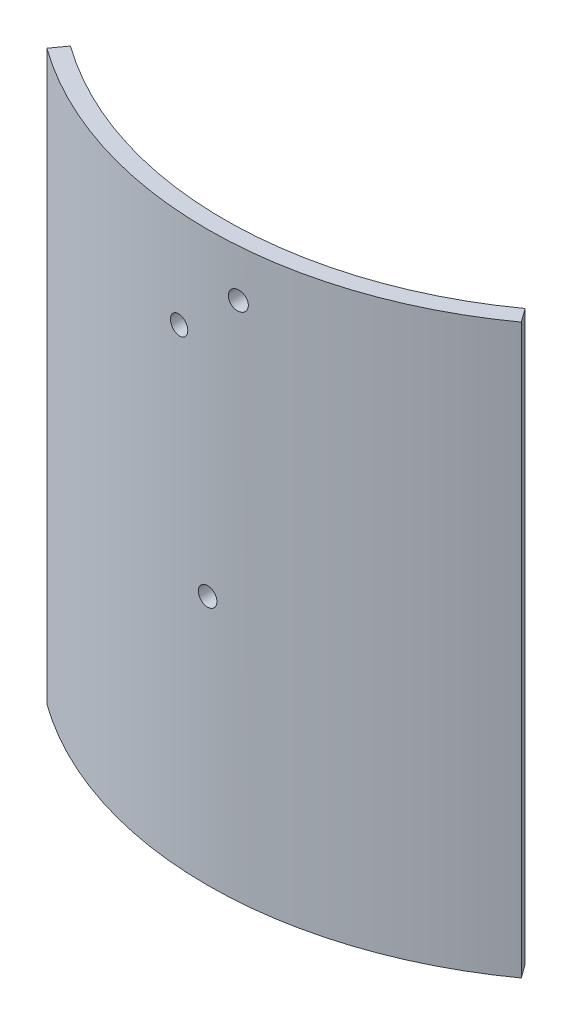
ISO-10303-21;
HEADER;
FILE_DESCRIPTION(('STEP AP214'),'2;1');
FILE_NAME('part.step','',(''),(''),'','','');
FILE_SCHEMA(('AUTOMOTIVE_DESIGN { 1 0 10303 214 1 1 1 1 }'));
ENDSEC;
DATA;
#1=APPLICATION_CONTEXT('core data for automotive mechanical design processes');
#2=APPLICATION_PROTOCOL_DEFINITION('international standard','automotive_design',2000,#1);
#3=PRODUCT_CONTEXT('',#1,'mechanical');
#4=PRODUCT('Part','Part','',(#3));
#5=PRODUCT_RELATED_PRODUCT_CATEGORY('part','',(#4));
#6=PRODUCT_DEFINITION_FORMATION('','',#4);
#7=PRODUCT_DEFINITION_CONTEXT('part definition',#1,'design');
#8=PRODUCT_DEFINITION('design','',#6,#7);
#9=PRODUCT_DEFINITION_SHAPE('','',#8);
#10=(LENGTH_UNIT() NAMED_UNIT(*) SI_UNIT(.MILLI.,.METRE.));
#11=(NAMED_UNIT(*) PLANE_ANGLE_UNIT() SI_UNIT($,.RADIAN.));
#12=(NAMED_UNIT(*) SI_UNIT($,.STERADIAN.) SOLID_ANGLE_UNIT());
#13=UNCERTAINTY_MEASURE_WITH_UNIT(LENGTH_MEASURE(1.E-05),#10,'distance_accuracy_value','');
#14=(GEOMETRIC_REPRESENTATION_CONTEXT(3) GLOBAL_UNCERTAINTY_ASSIGNED_CONTEXT((#13)) GLOBAL_UNIT_ASSIGNED_CONTEXT((#10,
#11,#12)) REPRESENTATION_CONTEXT('',''));
#15=CARTESIAN_POINT('',(0.,0.,0.));
#16=DIRECTION('',(0.,0.,1.));
#17=DIRECTION('',(1.,0.,0.));
#18=AXIS2_PLACEMENT_3D('',#15,#16,#17);
#19=CARTESIAN_POINT('',(0.,114.3,0.));
#20=DIRECTION('',(0.,-1.,0.));
#21=DIRECTION('',(0.,0.,-1.));
#22=AXIS2_PLACEMENT_3D('',#19,#20,#21);
#23=CYLINDRICAL_SURFACE('',#22,76.2);
#24=CARTESIAN_POINT('',(-7.30885000000002,95.885,75.8486698082273));
#25=CARTESIAN_POINT('',(-7.3088455969019,95.9831297900227,75.8486704045491));
#26=CARTESIAN_POINT('',(-7.30058014081593,96.0813305966038,75.8494681097695));
#27=CARTESIAN_POINT('',(-7.26772943756529,96.2750201833792,75.852622700145));
#28=CARTESIAN_POINT('',(-7.24312461224814,96.3705055665923,75.8549814557697));
#29=CARTESIAN_POINT('',(-7.17831763286796,96.5559235349163,75.8611416280274));
#30=CARTESIAN_POINT('',(-7.13812467757525,96.6458593586859,75.8649421937994));
#31=CARTESIAN_POINT('',(-7.04331224321324,96.8176734032789,75.8738031775397));
#32=CARTESIAN_POINT('',(-6.98869615052778,96.8995535093048,75.8788632997628));
#33=CARTESIAN_POINT('',(-6.86644618641582,97.0531833290188,75.8900235999919));
#34=CARTESIAN_POINT('',(-6.79878110415312,97.1249080247993,75.8961262675017));
#35=CARTESIAN_POINT('',(-6.65243968658897,97.2559945208843,75.9090932055006));
#36=CARTESIAN_POINT('',(-6.57376269295756,97.3153555815197,75.9159575215186));
#37=CARTESIAN_POINT('',(-6.40727976822505,97.4202769424109,75.9301900642785));
#38=CARTESIAN_POINT('',(-6.31943807056368,97.4657802331724,75.9375602237468));
#39=CARTESIAN_POINT('',(-6.13737479423293,97.5413867321775,75.9524915020096));
#40=CARTESIAN_POINT('',(-6.04315312601825,97.5714897242214,75.9600526234834));
#41=CARTESIAN_POINT('',(-5.85075291957231,97.6155018893836,75.9751144676348));
#42=CARTESIAN_POINT('',(-5.7525653461878,97.6293716442905,75.9826149995523));
#43=CARTESIAN_POINT('',(-5.55523264248106,97.6403834522302,75.9972971752068));
#44=CARTESIAN_POINT('',(-5.45608751301077,97.6375255201442,76.0044788192275));
#45=CARTESIAN_POINT('',(-5.25967853452254,97.6151500621406,76.0183232797139));
#46=CARTESIAN_POINT('',(-5.16241429658897,97.5956360187352,76.0249862043174));
#47=CARTESIAN_POINT('',(-4.97252186895324,97.5404887545858,76.0376425672563));
#48=CARTESIAN_POINT('',(-4.87989364097644,97.5048556669441,76.0436360111195));
#49=CARTESIAN_POINT('',(-4.70210044909963,97.4185518132351,76.0548366611935));
#50=CARTESIAN_POINT('',(-4.616921387189,97.3679102857894,76.0600453667002));
#51=CARTESIAN_POINT('',(-4.45626758401337,97.2529908994206,76.0696270903777));
#52=CARTESIAN_POINT('',(-4.38079272830127,97.1887132013401,76.0740001184044));
#53=CARTESIAN_POINT('',(-4.24186740412525,97.0484966638141,76.081873025589));
#54=CARTESIAN_POINT('',(-4.17839129274906,96.9725833351597,76.0853747719793));
#55=CARTESIAN_POINT('',(-4.06508207761271,96.8111478381676,76.0915129173219));
#56=CARTESIAN_POINT('',(-4.01524886155693,96.7256257489285,76.0941493233968));
#57=CARTESIAN_POINT('',(-3.93071993194743,96.5475399704268,76.0985626568721));
#58=CARTESIAN_POINT('',(-3.89600155632552,96.4549870690731,76.1003408714185));
#59=CARTESIAN_POINT('',(-3.84258751688773,96.2653560784846,76.1030567226227));
#60=CARTESIAN_POINT('',(-3.82389177848554,96.1682780103169,76.1039943631933));
#61=CARTESIAN_POINT('',(-3.80306624817922,95.9724296876484,76.1050379287701));
#62=CARTESIAN_POINT('',(-3.80092417581769,95.8736607420663,76.1051444703337));
#63=CARTESIAN_POINT('',(-3.81323481755456,95.6771652600538,76.1045286218797));
#64=CARTESIAN_POINT('',(-3.82768749905405,95.5794387215761,76.1038062334906));
#65=CARTESIAN_POINT('',(-3.87277026467221,95.3878192163899,76.1015253098916));
#66=CARTESIAN_POINT('',(-3.90339758378465,95.2939255974099,76.0999669175935));
#67=CARTESIAN_POINT('',(-3.97995206408727,95.1126173833369,76.0960014861131));
#68=CARTESIAN_POINT('',(-4.02587922233239,95.0252027869968,76.0935944470942));
#69=CARTESIAN_POINT('',(-4.13173771889866,94.8593017476186,76.0879198239681));
#70=CARTESIAN_POINT('',(-4.19167354316252,94.7808181765249,76.0846519641609));
#71=CARTESIAN_POINT('',(-4.32382874046206,94.6350301926022,76.0772559525899));
#72=CARTESIAN_POINT('',(-4.39604815457104,94.5677258171552,76.0731277979496));
#73=CARTESIAN_POINT('',(-4.5507842585696,94.4461335928397,76.0640280508263));
#74=CARTESIAN_POINT('',(-4.63331065530573,94.3918581569754,76.0590556616573));
#75=CARTESIAN_POINT('',(-4.80625474344153,94.2979280744795,76.0483228743164));
#76=CARTESIAN_POINT('',(-4.89667249018186,94.258273530392,76.042562470618));
#77=CARTESIAN_POINT('',(-5.0829938726129,94.1946321056603,76.030335375408));
#78=CARTESIAN_POINT('',(-5.17890675279072,94.1706725236483,76.0238674760065));
#79=CARTESIAN_POINT('',(-5.37335475575199,94.139188769204,76.0103713554344));
#80=CARTESIAN_POINT('',(-5.47188991811614,94.1316648449938,76.0033431258031));
#81=CARTESIAN_POINT('',(-5.66901824156279,94.1332502681506,75.9888940622357));
#82=CARTESIAN_POINT('',(-5.76761104344411,94.142396680962,75.9814723891337));
#83=CARTESIAN_POINT('',(-5.96184673760149,94.1771265206207,75.9664786341137));
#84=CARTESIAN_POINT('',(-6.05748958751689,94.202710183388,75.9589065500384));
#85=CARTESIAN_POINT('',(-6.24327396134473,94.2696456872958,75.9438624048451));
#86=CARTESIAN_POINT('',(-6.33340633561111,94.3110229692841,75.936390525347));
#87=CARTESIAN_POINT('',(-6.50543948127761,94.4083775551144,75.921846123491));
#88=CARTESIAN_POINT('',(-6.58734055952279,94.4643543144395,75.9147735862507));
#89=CARTESIAN_POINT('',(-6.74053139539101,94.5892962705101,75.9013251290746));
#90=CARTESIAN_POINT('',(-6.81182775309321,94.6582533276208,75.8949487765158));
#91=CARTESIAN_POINT('',(-6.94183920214558,94.8072588433483,75.8831677136136));
#92=CARTESIAN_POINT('',(-7.00055135944824,94.8873098814149,75.8777632299117));
#93=CARTESIAN_POINT('',(-7.10353238831327,95.0559844050343,75.8681916473328));
#94=CARTESIAN_POINT('',(-7.14783884903606,95.144584785348,75.8640213307097));
#95=CARTESIAN_POINT('',(-7.22088816267678,95.3279512535276,75.8571033820842));
#96=CARTESIAN_POINT('',(-7.24965014140811,95.4227096030379,75.8543540019554));
#97=CARTESIAN_POINT('',(-7.28306780236431,95.5792364923504,75.8511507938312));
#98=CARTESIAN_POINT('',(-7.29272370706151,95.6399733275835,75.8502223038156));
#99=CARTESIAN_POINT('',(-7.30561617555563,95.7621308274326,75.8489816251634));
#100=CARTESIAN_POINT('',(-7.3088527572037,95.8235514901464,75.8486694348129));
#101=CARTESIAN_POINT('',(-7.30885000000002,95.885,75.8486698082273));
#102=B_SPLINE_CURVE_WITH_KNOTS('',3,(#24,#25,#26,#27,#28,#29,#30,#31,#32,#33,#34,#35,#36,#37,
#38,#39,#40,#41,#42,#43,#44,#45,#46,#47,#48,#49,#50,#51,#52,#53,#54,#55,#56,#57,#58,#59,#60,#61,
#62,#63,#64,#65,#66,#67,#68,#69,#70,#71,#72,#73,#74,#75,#76,#77,#78,#79,#80,#81,#82,#83,#84,#85,
#86,#87,#88,#89,#90,#91,#92,#93,#94,#95,#96,#97,#98,#99,#100,#101),.UNSPECIFIED.,.T.,.F.,(4,2,2,
2,2,2,2,2,2,2,2,2,2,2,2,2,2,2,2,2,2,2,2,2,2,2,2,2,2,2,2,2,2,2,2,2,2,2,4),(0.,0.294164506698125,
0.588682124598543,0.883026207394075,1.17730124299184,1.47228906253624,1.76729452500647,
2.06349770806407,2.35970504930802,2.65663017083409,2.95355502821011,3.25041781880539,
3.54727815811332,3.8435639299505,4.1398462072041,4.43548794813699,4.73112725554931,
5.02632176387592,5.32151489804732,5.61648902000534,5.91146256251389,6.20638569648648,
6.5013087736895,6.79632642271369,7.09134505822347,7.38664365981845,7.68194433245729,
7.97775727454512,8.27357468416432,8.57005062771394,8.86653082661201,9.1634906342881,
9.46043936783048,9.75720250851653,10.0540347654155,10.3500861555467,10.6457724521777,
10.8299776853789,11.014182406333),.UNSPECIFIED.);
#103=CARTESIAN_POINT('',(-7.30885000000002,95.885,75.8486698082273));
#104=VERTEX_POINT('',#103);
#105=EDGE_CURVE('E125',#104,#104,#102,.T.);
#106=ORIENTED_EDGE('',*,*,#105,.T.);
#107=EDGE_LOOP('',(#106));
#108=FACE_BOUND('',#107,.T.);
#109=CARTESIAN_POINT('',(3.80364999999998,105.41,76.1050080262626));
#110=CARTESIAN_POINT('',(3.80365436460022,105.508341511283,76.1050079799172));
#111=CARTESIAN_POINT('',(3.8119550789413,105.606754012567,76.1045943547275));
#112=CARTESIAN_POINT('',(3.8449511460436,105.800867243808,76.1029343261118));
#113=CARTESIAN_POINT('',(3.86966613711016,105.89656458212,76.1016869251316));
#114=CARTESIAN_POINT('',(3.93478113670683,106.082406602789,76.0983479065199));
#115=CARTESIAN_POINT('',(3.97517342808287,106.172553991853,76.0962567042299));
#116=CARTESIAN_POINT('',(4.07047761780638,106.3447569792,76.091218139315));
#117=CARTESIAN_POINT('',(4.12538592722295,106.426814570725,76.0882709882965));
#118=CARTESIAN_POINT('',(4.24818742335738,106.580582935634,76.0815133623831));
#119=CARTESIAN_POINT('',(4.3160868562273,106.65228870263,76.0777024720376));
#120=CARTESIAN_POINT('',(4.4629174311383,106.783284809845,76.0692300758492));
#121=CARTESIAN_POINT('',(4.54184904825515,106.842574615125,76.0645685333723));
#122=CARTESIAN_POINT('',(4.70859098285083,106.947132394885,76.0544288312417));
#123=CARTESIAN_POINT('',(4.79641158561531,106.992383874101,76.0489497220401));
#124=CARTESIAN_POINT('',(4.9783548848172,107.067507488873,76.0372558998053));
#125=CARTESIAN_POINT('',(5.07247763167081,107.09737950138,76.031041180887));
#126=CARTESIAN_POINT('',(5.26454594134623,107.14096269742,76.017983622515));
#127=CARTESIAN_POINT('',(5.36249863538503,107.154642090597,76.0111395758057));
#128=CARTESIAN_POINT('',(5.55927802477874,107.165365287631,75.9970009778684));
#129=CARTESIAN_POINT('',(5.65810473074042,107.162408889323,75.9897064211667));
#130=CARTESIAN_POINT('',(5.85405749396384,107.139931874031,75.9748622156312));
#131=CARTESIAN_POINT('',(5.95117935527185,107.120375014594,75.9673120433873));
#132=CARTESIAN_POINT('',(6.14075270753954,107.065206640089,75.9522231684793));
#133=CARTESIAN_POINT('',(6.2332041457752,107.029594943825,75.9446844659455));
#134=CARTESIAN_POINT('',(6.41091588261515,106.943271551864,75.9298895375268));
#135=CARTESIAN_POINT('',(6.49616833000474,106.892543636563,75.922633624578));
#136=CARTESIAN_POINT('',(6.65694348996355,106.777426615949,75.9087058592588));
#137=CARTESIAN_POINT('',(6.73246624300256,106.713037567461,75.9020340044592));
#138=CARTESIAN_POINT('',(6.8715221217819,106.572507562271,75.8895714964618));
#139=CARTESIAN_POINT('',(6.93507157203987,106.496382867515,75.8837796455759));
#140=CARTESIAN_POINT('',(7.04847502083984,106.334467326194,75.8733303186513));
#141=CARTESIAN_POINT('',(7.09832929399006,106.248676673495,75.8686728198674));
#142=CARTESIAN_POINT('',(7.18273400130964,106.070200845101,75.8607285205186));
#143=CARTESIAN_POINT('',(7.21734022419332,105.9775422765,75.8574367258193));
#144=CARTESIAN_POINT('',(7.27050575320777,105.787691331065,75.8523596584288));
#145=CARTESIAN_POINT('',(7.28906545376543,105.690499065732,75.8505743487081));
#146=CARTESIAN_POINT('',(7.30955390094289,105.494739247363,75.8486026857167));
#147=CARTESIAN_POINT('',(7.31154616379525,105.396178399204,75.8484102257929));
#148=CARTESIAN_POINT('',(7.29900849968582,105.200124011844,75.8496177522981));
#149=CARTESIAN_POINT('',(7.28447875564458,105.102630460838,75.8510177210968));
#150=CARTESIAN_POINT('',(7.23935030593194,104.911602148347,75.8553380765591));
#151=CARTESIAN_POINT('',(7.20877175380069,104.818062580413,75.8582565562895));
#152=CARTESIAN_POINT('',(7.1324437081674,104.637450884053,75.8654711170246));
#153=CARTESIAN_POINT('',(7.0866940694673,104.550378817537,75.8697672112141));
#154=CARTESIAN_POINT('',(6.98121776358184,104.384954637362,75.8795453296464));
#155=CARTESIAN_POINT('',(6.92145973585607,104.306622679581,75.8850300126675));
#156=CARTESIAN_POINT('',(6.78972864956794,104.161092109079,75.8969297620912));
#157=CARTESIAN_POINT('',(6.71775531395234,104.093893748944,75.9033448495958));
#158=CARTESIAN_POINT('',(6.5633123580516,103.972246877219,75.9168555240617));
#159=CARTESIAN_POINT('',(6.4808010184062,103.91785162793,75.9239537865437));
#160=CARTESIAN_POINT('',(6.3078480913184,103.823682649996,75.9385183846647));
#161=CARTESIAN_POINT('',(6.21740636038195,103.783909185988,75.9459847269626));
#162=CARTESIAN_POINT('',(6.0308460219036,103.719994666469,75.9610273350804));
#163=CARTESIAN_POINT('',(5.93471046890599,103.695903125501,75.9686038725904));
#164=CARTESIAN_POINT('',(5.73974269194737,103.664236229182,75.9835831580521));
#165=CARTESIAN_POINT('',(5.64091044816314,103.656660995275,75.9909859047257));
#166=CARTESIAN_POINT('',(5.44329320577658,103.658253219773,76.0053970435576));
#167=CARTESIAN_POINT('',(5.34450826809288,103.667430419323,76.0124052038306));
#168=CARTESIAN_POINT('',(5.14985704276549,103.702303424844,76.0258409604903));
#169=CARTESIAN_POINT('',(5.05399074036261,103.727999147269,76.0322685598132));
#170=CARTESIAN_POINT('',(4.86806254836808,103.795144214849,76.0443991395164));
#171=CARTESIAN_POINT('',(4.77799192683873,103.836569179571,76.0501032231887));
#172=CARTESIAN_POINT('',(4.60607683097795,103.934012436358,76.0607091918171));
#173=CARTESIAN_POINT('',(4.52423194098907,103.990029990525,76.0656111173152));
#174=CARTESIAN_POINT('',(4.37129497494305,104.114927204204,76.0745532077728));
#175=CARTESIAN_POINT('',(4.30017826367435,104.183776558651,76.0785953560834));
#176=CARTESIAN_POINT('',(4.1704925036053,104.332494866878,76.0858148611535));
#177=CARTESIAN_POINT('',(4.11192644779846,104.412366441711,76.088992011683));
#178=CARTESIAN_POINT('',(4.00911430282368,104.580723981036,76.0944785004198));
#179=CARTESIAN_POINT('',(3.96485005906502,104.669198837418,76.0967889394279));
#180=CARTESIAN_POINT('',(3.89184834523541,104.852270050492,76.1005575887988));
#181=CARTESIAN_POINT('',(3.86309222672467,104.946858901097,76.1020168229043));
#182=CARTESIAN_POINT('',(3.82957856334626,105.103374921581,76.1037087289822));
#183=CARTESIAN_POINT('',(3.81986761205691,105.164283314642,76.1041960358821));
#184=CARTESIAN_POINT('',(3.80690196447756,105.286785180974,76.1048456989652));
#185=CARTESIAN_POINT('',(3.80364726511683,105.348378653921,76.105008055303));
#186=CARTESIAN_POINT('',(3.80364999999998,105.41,76.1050080262626));
#187=B_SPLINE_CURVE_WITH_KNOTS('',3,(#109,#110,#111,#112,#113,#114,#115,#116,#117,#118,#119,
#120,#121,#122,#123,#124,#125,#126,#127,#128,#129,#130,#131,#132,#133,#134,#135,#136,#137,#138,
#139,#140,#141,#142,#143,#144,#145,#146,#147,#148,#149,#150,#151,#152,#153,#154,#155,#156,#157,
#158,#159,#160,#161,#162,#163,#164,#165,#166,#167,#168,#169,#170,#171,#172,#173,#174,#175,#176,
#177,#178,#179,#180,#181,#182,#183,#184,#185,#186),.UNSPECIFIED.,.T.,.F.,(4,2,2,2,2,2,2,2,2,2,2,
2,2,2,2,2,2,2,2,2,2,2,2,2,2,2,2,2,2,2,2,2,2,2,2,2,2,2,4),(0.,0.294799559015695,
0.589952457885218,0.884960251574542,1.17989517582948,1.47497226322716,1.77006206136156,
2.06549729294895,2.36093488825552,2.65695154806072,2.95297180518727,3.24964000676851,
3.54631155666362,3.84330258650024,4.14029238099004,4.43687427919522,4.7334502300678,
5.02893188777559,5.32440628227551,5.6187473624858,5.91308518398143,6.20705426745258,
6.50102616449748,6.7956625688285,7.09030565664884,7.38615364237876,7.68200698234483,
7.97878998414109,8.27557516815931,8.57253298072394,8.86948929135858,9.16598718428464,
9.46247008722706,9.75826145652617,10.054123285803,10.3496080616221,10.6447367217519,
10.8294598773468,11.0141829450837),.UNSPECIFIED.);
#188=CARTESIAN_POINT('',(3.80364999999998,105.41,76.1050080262626));
#189=VERTEX_POINT('',#188);
#190=EDGE_CURVE('E151',#189,#189,#187,.T.);
#191=ORIENTED_EDGE('',*,*,#190,.T.);
#192=EDGE_LOOP('',(#191));
#193=FACE_BOUND('',#192,.T.);
#194=CARTESIAN_POINT('',(-1.75260000000003,54.61,76.1798424338092));
#195=CARTESIAN_POINT('',(-1.75259563930515,54.7084303414838,76.1798427060606));
#196=CARTESIAN_POINT('',(-1.74428003412436,54.8069317228901,76.1800352523601));
#197=CARTESIAN_POINT('',(-1.71122336623507,55.0012207480361,76.1807848304841));
#198=CARTESIAN_POINT('',(-1.68646262125115,55.0970049963796,76.1813422990522));
#199=CARTESIAN_POINT('',(-1.62122178813276,55.2830169406673,76.182758537902));
#200=CARTESIAN_POINT('',(-1.58074931508791,55.3732473039361,76.1836171622015));
#201=CARTESIAN_POINT('',(-1.48524462344363,55.5456076659428,76.1855387755263));
#202=CARTESIAN_POINT('',(-1.43021598632572,55.6277396504375,76.1866017142633));
#203=CARTESIAN_POINT('',(-1.30713914143808,55.7816241715264,76.1888125982125));
#204=CARTESIAN_POINT('',(-1.23908742377864,55.853373900792,76.1899605662899));
#205=CARTESIAN_POINT('',(-1.09190159159452,55.9844338175553,76.1922119153324));
#206=CARTESIAN_POINT('',(-1.01276703847156,56.0437435125121,76.1933152945306));
#207=CARTESIAN_POINT('',(-0.845654699155653,56.1482416296419,76.1953531445735));
#208=CARTESIAN_POINT('',(-0.757676098576607,56.1934287497891,76.196287599841));
#209=CARTESIAN_POINT('',(-0.575378940535037,56.2683903850022,76.1978821189006));
#210=CARTESIAN_POINT('',(-0.481060403265161,56.2981649491544,76.1985421835666));
#211=CARTESIAN_POINT('',(-0.288778399985069,56.3414512950049,76.1995134084227));
#212=CARTESIAN_POINT('',(-0.19081558366155,56.3549659612614,76.199824630498));
#213=CARTESIAN_POINT('',(0.00598877908284789,56.3653577512414,76.2000632928609));
#214=CARTESIAN_POINT('',(0.104830322789346,56.3622349263402,76.1999907343338));
#215=CARTESIAN_POINT('',(0.30056682363872,56.3394428580053,76.19947006902));
#216=CARTESIAN_POINT('',(0.397462145001877,56.3197767406227,76.1990220331843));
#217=CARTESIAN_POINT('',(0.586575636972465,56.2644611647055,76.1978009968408));
#218=CARTESIAN_POINT('',(0.678793799496568,56.2288116785484,76.1970279957714));
#219=CARTESIAN_POINT('',(0.855945218161159,56.1425377447574,76.1952440397538));
#220=CARTESIAN_POINT('',(0.94087777586792,56.0919118634778,76.1942330620269));
#221=CARTESIAN_POINT('',(1.10103935868831,55.9771233162989,76.1920871062238));
#222=CARTESIAN_POINT('',(1.17626837238357,55.9129606344708,76.1909521280017));
#223=CARTESIAN_POINT('',(1.31490562535691,55.7729021260035,76.1886857903196));
#224=CARTESIAN_POINT('',(1.37831112165166,55.6970035841689,76.1875544317588));
#225=CARTESIAN_POINT('',(1.49148035800491,55.5356374427632,76.1854231491533));
#226=CARTESIAN_POINT('',(1.54124409603539,55.4501698417695,76.1844232251279));
#227=CARTESIAN_POINT('',(1.62571687133451,55.272090212667,76.1826675728237));
#228=CARTESIAN_POINT('',(1.66042582325269,55.1794781440574,76.1819118459293));
#229=CARTESIAN_POINT('',(1.71380200520409,54.9897392186514,76.1807298566071));
#230=CARTESIAN_POINT('',(1.73246926122296,54.8926123691687,76.1803035936456));
#231=CARTESIAN_POINT('',(1.75322879257177,54.6966248422234,76.1798286886435));
#232=CARTESIAN_POINT('',(1.75532486547436,54.5977645672101,76.1797799600845));
#233=CARTESIAN_POINT('',(1.74289242300204,54.4010955616575,76.1800653923492));
#234=CARTESIAN_POINT('',(1.72836391863552,54.3032868304218,76.1803995529194));
#235=CARTESIAN_POINT('',(1.68309788097003,54.1115079597491,76.1814130130611));
#236=CARTESIAN_POINT('',(1.6523620702951,54.0175374135068,76.1820922759523));
#237=CARTESIAN_POINT('',(1.57555565740287,53.8360899494674,76.183719332675));
#238=CARTESIAN_POINT('',(1.52948503785143,53.7486130390106,76.1846671268099));
#239=CARTESIAN_POINT('',(1.42330700453581,53.5826185276612,76.1867246078283));
#240=CARTESIAN_POINT('',(1.36319703227441,53.5041025636766,76.1878343242063));
#241=CARTESIAN_POINT('',(1.23065036356723,53.3582751750005,76.1900904408169));
#242=CARTESIAN_POINT('',(1.15821364658422,53.2909637689771,76.1912368411107));
#243=CARTESIAN_POINT('',(1.00305346823081,53.1694435982693,76.1934373372802));
#244=CARTESIAN_POINT('',(0.920328088054838,53.1152372832119,76.1944914158755));
#245=CARTESIAN_POINT('',(0.746948729054476,53.0214827984009,76.1963881931696));
#246=CARTESIAN_POINT('',(0.656294764188809,52.9819346028413,76.1972308922404));
#247=CARTESIAN_POINT('',(0.469640837411378,52.9186232661448,76.1986098286356));
#248=CARTESIAN_POINT('',(0.373641416024191,52.8948585321379,76.1991460968842));
#249=CARTESIAN_POINT('',(0.179013926098036,52.8637834810564,76.1998518396941));
#250=CARTESIAN_POINT('',(0.0803858569584952,52.856473167741,76.2000213141714));
#251=CARTESIAN_POINT('',(-0.116674565023091,52.8585146824683,76.199974365389));
#252=CARTESIAN_POINT('',(-0.215106958024782,52.8678626383956,76.1997580318081));
#253=CARTESIAN_POINT('',(-0.409004932836326,52.9029474005142,76.1989640243434));
#254=CARTESIAN_POINT('',(-0.504470508728896,52.9286842393906,76.198386349739));
#255=CARTESIAN_POINT('',(-0.689727038085921,52.9958159109376,76.1969347471354));
#256=CARTESIAN_POINT('',(-0.77951789059649,53.0372110220788,76.1960608138675));
#257=CARTESIAN_POINT('',(-0.950872901860898,53.1344821125609,76.1941152071278));
#258=CARTESIAN_POINT('',(-1.03243736847085,53.1903575497248,76.19304354106));
#259=CARTESIAN_POINT('',(-1.18504034740304,53.315011790335,76.1908230347117));
#260=CARTESIAN_POINT('',(-1.25607753179294,53.3837922191672,76.1896741847216));
#261=CARTESIAN_POINT('',(-1.38561537877095,53.5323228865533,76.1874286180734));
#262=CARTESIAN_POINT('',(-1.44411292796183,53.6120758413643,76.1863319144148));
#263=CARTESIAN_POINT('',(-1.54691695395182,53.7803117014157,76.1843140127345));
#264=CARTESIAN_POINT('',(-1.59121521392799,53.8687996227973,76.1833929164574));
#265=CARTESIAN_POINT('',(-1.66427548902462,54.0518900362666,76.181832054111));
#266=CARTESIAN_POINT('',(-1.69305607136852,54.1464850685643,76.1811919519975));
#267=CARTESIAN_POINT('',(-1.72661893302397,54.3030665399075,76.1804367387127));
#268=CARTESIAN_POINT('',(-1.73634961516463,54.3640361807526,76.1802148392475));
#269=CARTESIAN_POINT('',(-1.74934151445548,54.4866612483275,76.1799176015024));
#270=CARTESIAN_POINT('',(-1.75260273271593,54.5483166749396,76.1798422631975));
#271=CARTESIAN_POINT('',(-1.75260000000003,54.61,76.1798424338092));
#272=B_SPLINE_CURVE_WITH_KNOTS('',3,(#194,#195,#196,#197,#198,#199,#200,#201,#202,#203,#204,
#205,#206,#207,#208,#209,#210,#211,#212,#213,#214,#215,#216,#217,#218,#219,#220,#221,#222,#223,
#224,#225,#226,#227,#228,#229,#230,#231,#232,#233,#234,#235,#236,#237,#238,#239,#240,#241,#242,
#243,#244,#245,#246,#247,#248,#249,#250,#251,#252,#253,#254,#255,#256,#257,#258,#259,#260,#261,
#262,#263,#264,#265,#266,#267,#268,#269,#270,#271),.UNSPECIFIED.,.T.,.F.,(4,2,2,2,2,2,2,2,2,2,2,
2,2,2,2,2,2,2,2,2,2,2,2,2,2,2,2,2,2,2,2,2,2,2,2,2,2,2,4),(0.,0.295065875650502,0.59048553719893,
0.885762194479799,1.18096626767873,1.47625001455295,1.77154545045402,2.06686810298584,
2.36218981496196,2.65745912819053,2.95272752965168,3.24794014918015,3.54315327889418,
3.83839467762947,4.13363642377898,4.42894657921564,4.72425677855384,5.01956865207933,
5.3148800472337,5.61012376472231,5.90536728670805,6.20057943450387,6.49579191600239,
6.79105823833442,7.08632505260601,7.38164701608064,7.67696845963465,7.97226009476486,
8.26755179736169,8.56277487011666,8.85799853165291,9.15322744376955,9.44844530342946,
9.74370037081804,10.0390286607762,10.334527543611,10.6296720668076,10.8145809797625,
10.9994898609837),.UNSPECIFIED.);
#273=CARTESIAN_POINT('',(-1.75260000000003,54.61,76.1798424338092));
#274=VERTEX_POINT('',#273);
#275=EDGE_CURVE('E159',#274,#274,#272,.T.);
#276=ORIENTED_EDGE('',*,*,#275,.T.);
#277=EDGE_LOOP('',(#276));
#278=FACE_BOUND('',#277,.T.);
#279=CARTESIAN_POINT('',(0.,7.62,0.));
#280=DIRECTION('',(0.,-1.,0.));
#281=DIRECTION('',(0.,0.,-1.));
#282=AXIS2_PLACEMENT_3D('',#279,#280,#281);
#283=CIRCLE('',#282,76.2);
#284=CARTESIAN_POINT('',(44.5484617282884,7.62,61.8213115166867));
#285=VERTEX_POINT('',#284);
#286=CARTESIAN_POINT('',(-44.5484617282885,7.62,61.8213115166867));
#287=VERTEX_POINT('',#286);
#288=EDGE_CURVE('E60',#285,#287,#283,.T.);
#289=ORIENTED_EDGE('',*,*,#288,.F.);
#290=DIRECTION('',(0.,-1.,0.));
#291=VECTOR('',#290,1.);
#292=CARTESIAN_POINT('',(44.5484617282884,114.3,61.8213115166867));
#293=LINE('',#292,#291);
#294=CARTESIAN_POINT('',(44.5484617282884,114.3,61.8213115166867));
#295=VERTEX_POINT('',#294);
#296=EDGE_CURVE('E54',#295,#285,#293,.T.);
#297=ORIENTED_EDGE('',*,*,#296,.F.);
#298=CARTESIAN_POINT('',(0.,114.3,0.));
#299=DIRECTION('',(0.,1.,0.));
#300=DIRECTION('',(0.,0.,-1.));
#301=AXIS2_PLACEMENT_3D('',#298,#299,#300);
#302=CIRCLE('',#301,76.2);
#303=CARTESIAN_POINT('',(-44.5484617282885,114.3,61.8213115166867));
#304=VERTEX_POINT('',#303);
#305=EDGE_CURVE('E166',#304,#295,#302,.T.);
#306=ORIENTED_EDGE('',*,*,#305,.F.);
#307=DIRECTION('',(0.,-1.,0.));
#308=VECTOR('',#307,1.);
#309=CARTESIAN_POINT('',(-44.5484617282885,114.3,61.8213115166867));
#310=LINE('',#309,#308);
#311=EDGE_CURVE('E112',#304,#287,#310,.T.);
#312=ORIENTED_EDGE('',*,*,#311,.T.);
#313=EDGE_LOOP('',(#289,#297,#306,#312));
#314=FACE_BOUND('',#313,.T.);
#315=ADVANCED_FACE('F45',(#108,#193,#278,#314),#23,.T.);
#316=CARTESIAN_POINT('',(42.6922758229431,114.3,59.2454235368247));
#317=DIRECTION('',(-0.811303300743922,0.,0.584625481998534));
#318=DIRECTION('',(0.584625481998534,0.,0.811303300743922));
#319=AXIS2_PLACEMENT_3D('',#316,#317,#318);
#320=PLANE('',#319);
#321=DIRECTION('',(0.584625481998534,0.,0.811303300743922));
#322=VECTOR('',#321,1.);
#323=CARTESIAN_POINT('',(42.6922758229431,7.62,59.2454235368247));
#324=LINE('',#323,#322);
#325=CARTESIAN_POINT('',(42.6922758229431,7.62,59.2454235368248));
#326=VERTEX_POINT('',#325);
#327=EDGE_CURVE('E88',#326,#285,#324,.T.);
#328=ORIENTED_EDGE('',*,*,#327,.F.);
#329=DIRECTION('',(0.,-1.,0.));
#330=VECTOR('',#329,1.);
#331=CARTESIAN_POINT('',(42.6922758229431,114.3,59.2454235368248));
#332=LINE('',#331,#330);
#333=CARTESIAN_POINT('',(42.6922758229431,114.3,59.2454235368248));
#334=VERTEX_POINT('',#333);
#335=EDGE_CURVE('E99',#334,#326,#332,.T.);
#336=ORIENTED_EDGE('',*,*,#335,.F.);
#337=DIRECTION('',(-0.584625481998534,0.,-0.811303300743922));
#338=VECTOR('',#337,1.);
#339=CARTESIAN_POINT('',(42.6922758229431,114.3,59.2454235368247));
#340=LINE('',#339,#338);
#341=EDGE_CURVE('E264',#295,#334,#340,.T.);
#342=ORIENTED_EDGE('',*,*,#341,.F.);
#343=ORIENTED_EDGE('',*,*,#296,.T.);
#344=EDGE_LOOP('',(#328,#336,#342,#343));
#345=FACE_BOUND('',#344,.T.);
#346=ADVANCED_FACE('F98',(#345),#320,.F.);
#347=CARTESIAN_POINT('',(0.,114.3,0.));
#348=DIRECTION('',(0.,-1.,0.));
#349=DIRECTION('',(0.,0.,-1.));
#350=AXIS2_PLACEMENT_3D('',#347,#348,#349);
#351=CYLINDRICAL_SURFACE('',#350,73.025);
#352=CARTESIAN_POINT('',(-7.30885000000002,95.885,72.6583191154151));
#353=CARTESIAN_POINT('',(-7.30884559358313,95.7868982030991,72.6583197381673));
#354=CARTESIAN_POINT('',(-7.30058480208319,95.6887254212424,72.659152000199));
#355=CARTESIAN_POINT('',(-7.26775327418095,95.4950917831559,72.6624431801704));
#356=CARTESIAN_POINT('',(-7.24316297684829,95.399634322767,72.6649040489877));
#357=CARTESIAN_POINT('',(-7.17839643208209,95.2142718762482,72.6713306766371));
#358=CARTESIAN_POINT('',(-7.13822953220721,95.1243635974782,72.6752955328915));
#359=CARTESIAN_POINT('',(-7.04348157095181,94.9526005955001,72.6845392571663));
#360=CARTESIAN_POINT('',(-6.9889038753896,94.8707439978424,72.6898178183384));
#361=CARTESIAN_POINT('',(-6.8667305001372,94.717137558701,72.701460792239));
#362=CARTESIAN_POINT('',(-6.79910098764538,94.6454148418425,72.7078280220029));
#363=CARTESIAN_POINT('',(-6.65283699021549,94.5143252117427,72.7213570291669));
#364=CARTESIAN_POINT('',(-6.57420182751415,94.4549590600187,72.7285188554951));
#365=CARTESIAN_POINT('',(-6.40777621711294,94.3499980960944,72.7433710273579));
#366=CARTESIAN_POINT('',(-6.31994680582694,94.3044653695843,72.7510635708717));
#367=CARTESIAN_POINT('',(-6.13790412965119,94.2287989445092,72.7666482379349));
#368=CARTESIAN_POINT('',(-6.04369076598924,94.1986654842624,72.7745403645711));
#369=CARTESIAN_POINT('',(-5.85128043471568,94.1545866576116,72.7902636237875));
#370=CARTESIAN_POINT('',(-5.7530736053399,94.1406842456676,72.7980945402891));
#371=CARTESIAN_POINT('',(-5.55569513676265,94.1296149641398,72.8134237181841));
#372=CARTESIAN_POINT('',(-5.45652349833231,94.1324480811811,72.8209219798434));
#373=CARTESIAN_POINT('',(-5.26005705149229,94.1547836478111,72.8353768929429));
#374=CARTESIAN_POINT('',(-5.16276182339131,94.1742823245898,72.8423336665782));
#375=CARTESIAN_POINT('',(-4.97280342627251,94.2294102720985,72.8555483258202));
#376=CARTESIAN_POINT('',(-4.88014021514745,94.2650393961655,72.8618062177806));
#377=CARTESIAN_POINT('',(-4.70229173677865,94.3513406439452,72.8735000668718));
#378=CARTESIAN_POINT('',(-4.61709112015738,94.4019809037586,72.8789377285678));
#379=CARTESIAN_POINT('',(-4.45639370103566,94.5169063063638,72.8889406713202));
#380=CARTESIAN_POINT('',(-4.38089677417432,94.5811912742593,72.893505963557));
#381=CARTESIAN_POINT('',(-4.24194333991037,94.7214172396309,72.9017241653356));
#382=CARTESIAN_POINT('',(-4.17845889789489,94.7973304325423,72.9053791980771));
#383=CARTESIAN_POINT('',(-4.06513288088261,94.9587697044541,72.9117860966677));
#384=CARTESIAN_POINT('',(-4.01529118337469,95.0442956971224,72.9145379706272));
#385=CARTESIAN_POINT('',(-3.93075253383748,95.222380759933,72.919144315801));
#386=CARTESIAN_POINT('',(-3.89603089676519,95.3149280747241,72.9210002502701));
#387=CARTESIAN_POINT('',(-3.84260870109017,95.5045494232584,72.9238349588944));
#388=CARTESIAN_POINT('',(-3.82390806130866,95.6016234340622,72.9248137374941));
#389=CARTESIAN_POINT('',(-3.80307235612066,95.7974584001655,72.9259033320778));
#390=CARTESIAN_POINT('',(-3.80092391605901,95.8962179288281,72.926014848835));
#391=CARTESIAN_POINT('',(-3.8132187789112,96.0926957672822,72.9253729780742));
#392=CARTESIAN_POINT('',(-3.82766204626019,96.1904140793052,72.9246195924101));
#393=CARTESIAN_POINT('',(-3.87272257625909,96.3820170336793,72.9222404240718));
#394=CARTESIAN_POINT('',(-3.90333682671139,96.4759023864951,72.9206148038694));
#395=CARTESIAN_POINT('',(-3.97986141158111,96.6571959855355,72.9164781647868));
#396=CARTESIAN_POINT('',(-4.02577174297185,96.7446042330418,72.9139671460818));
#397=CARTESIAN_POINT('',(-4.13159401453417,96.910497528139,72.9080472546633));
#398=CARTESIAN_POINT('',(-4.19151083636059,96.988979450446,72.9046380688606));
#399=CARTESIAN_POINT('',(-4.32362429712166,97.1347670928717,72.8969221891377));
#400=CARTESIAN_POINT('',(-4.39582098031259,97.2020727727098,72.8926154919827));
#401=CARTESIAN_POINT('',(-4.55051416569949,97.3236770119387,72.8831218151488));
#402=CARTESIAN_POINT('',(-4.6330212309205,97.3779620626967,72.8779339307035));
#403=CARTESIAN_POINT('',(-4.80592416452865,97.4719148870517,72.866735988388));
#404=CARTESIAN_POINT('',(-4.89632009383924,97.5115825477503,72.8607259241681));
#405=CARTESIAN_POINT('',(-5.0826102190766,97.5752603545875,72.8479678789575));
#406=CARTESIAN_POINT('',(-5.17851447672596,97.599240788085,72.8412185257571));
#407=CARTESIAN_POINT('',(-5.37294536383072,97.6307680239711,72.8271349187484));
#408=CARTESIAN_POINT('',(-5.47147203593457,97.638314558929,72.8198006554237));
#409=CARTESIAN_POINT('',(-5.6686044791273,97.6367769708697,72.8047206151876));
#410=CARTESIAN_POINT('',(-5.76720986283835,97.6276524827211,72.7969738836795));
#411=CARTESIAN_POINT('',(-5.9614728391575,97.5929628128127,72.7813229262379));
#412=CARTESIAN_POINT('',(-6.05713038617458,97.5673973769121,72.7734186978717));
#413=CARTESIAN_POINT('',(-6.24296048613165,97.5004890659259,72.75771290147));
#414=CARTESIAN_POINT('',(-6.33312307917186,97.4591184747894,72.7499115388251));
#415=CARTESIAN_POINT('',(-6.50521716270747,97.3617670523223,72.7347251752899));
#416=CARTESIAN_POINT('',(-6.58714895835531,97.3057867629154,72.7273401589683));
#417=CARTESIAN_POINT('',(-6.74039654190094,97.1808288660585,72.7132973221907));
#418=CARTESIAN_POINT('',(-6.81171939226345,97.1118599751671,72.7066390187491));
#419=CARTESIAN_POINT('',(-6.94178052813133,96.9628192780164,72.6943366999393));
#420=CARTESIAN_POINT('',(-7.00051589652486,96.8827449051609,72.6886929197327));
#421=CARTESIAN_POINT('',(-7.10352189839053,96.7140360663338,72.6786989460127));
#422=CARTESIAN_POINT('',(-7.14783408058134,96.6254271587323,72.6743450400859));
#423=CARTESIAN_POINT('',(-7.22089248737267,96.4420379161932,72.6671225349594));
#424=CARTESIAN_POINT('',(-7.24965788322839,96.3472653442704,72.6642521066268));
#425=CARTESIAN_POINT('',(-7.28307350542659,96.1907297946497,72.6609084633833));
#426=CARTESIAN_POINT('',(-7.29272724268514,96.1299999024147,72.6599394231838));
#427=CARTESIAN_POINT('',(-7.3056168601374,96.0078559536188,72.6586445551567));
#428=CARTESIAN_POINT('',(-7.30885275977232,95.9464418991309,72.6583187253807));
#429=CARTESIAN_POINT('',(-7.30885000000002,95.885,72.6583191154151));
#430=B_SPLINE_CURVE_WITH_KNOTS('',3,(#352,#353,#354,#355,#356,#357,#358,#359,#360,#361,#362,
#363,#364,#365,#366,#367,#368,#369,#370,#371,#372,#373,#374,#375,#376,#377,#378,#379,#380,#381,
#382,#383,#384,#385,#386,#387,#388,#389,#390,#391,#392,#393,#394,#395,#396,#397,#398,#399,#400,
#401,#402,#403,#404,#405,#406,#407,#408,#409,#410,#411,#412,#413,#414,#415,#416,#417,#418,#419,
#420,#421,#422,#423,#424,#425,#426,#427,#428,#429),.UNSPECIFIED.,.T.,.F.,(4,2,2,2,2,2,2,2,2,2,2,
2,2,2,2,2,2,2,2,2,2,2,2,2,2,2,2,2,2,2,2,2,2,2,2,2,2,2,4),(0.,0.294080499682406,
0.588513912067564,0.882770906957733,1.17695923521371,1.47192065513084,1.76690024771845,
2.06318481729907,2.35947397202663,2.65654547283939,2.9536167362348,3.25062076536279,
3.54762209409151,3.84399744308513,4.14036899340249,4.43604263607601,4.73171362352901,
5.0269000714419,5.32208502362912,5.617031432813,5.91197720977105,6.206868066022,
6.50175886392166,6.79675259317602,7.09174738560205,7.38704691788628,7.68234873088623,
7.97820825783944,8.27407259931147,8.57065425928435,8.86724050386652,9.16434924974408,
9.46144697640399,9.75834602881085,10.0553138124712,10.3514183930786,10.6471569993986,
10.8313424037843,11.015527250226),.UNSPECIFIED.);
#431=CARTESIAN_POINT('',(-7.30885000000002,95.885,72.6583191154151));
#432=VERTEX_POINT('',#431);
#433=EDGE_CURVE('E116',#432,#432,#430,.T.);
#434=ORIENTED_EDGE('',*,*,#433,.T.);
#435=EDGE_LOOP('',(#434));
#436=FACE_BOUND('',#435,.T.);
#437=CARTESIAN_POINT('',(3.80364999999998,105.41,72.9258724437185));
#438=CARTESIAN_POINT('',(3.80365436452903,105.311667628356,72.9258723953003));
#439=CARTESIAN_POINT('',(3.81195354683465,105.213264300797,72.9254408182421));
#440=CARTESIAN_POINT('',(3.84494335160566,105.019169291615,72.9237087505963));
#441=CARTESIAN_POINT('',(3.86965360027442,104.923480999984,72.9224072196077));
#442=CARTESIAN_POINT('',(3.93475551615736,104.737656733511,72.9189233364081));
#443=CARTESIAN_POINT('',(3.97513944791047,104.64751804515,72.9167414186749));
#444=CARTESIAN_POINT('',(4.0704228032785,104.475331435684,72.9114843405006));
#445=CARTESIAN_POINT('',(4.12531864086538,104.393281522634,72.9084094007151));
#446=CARTESIAN_POINT('',(4.2480925639741,104.239524015449,72.9013587384048));
#447=CARTESIAN_POINT('',(4.31597732718235,104.167821774523,72.8973825523488));
#448=CARTESIAN_POINT('',(4.46277413372303,104.036830295216,72.888542772411));
#449=CARTESIAN_POINT('',(4.54168665566753,103.977541595869,72.8836791400107));
#450=CARTESIAN_POINT('',(4.708394595573,103.872976385362,72.8730994221869));
#451=CARTESIAN_POINT('',(4.79620122125166,103.827717852938,72.867382256795));
#452=CARTESIAN_POINT('',(4.97811365440396,103.752577281956,72.8551804049742));
#453=CARTESIAN_POINT('',(5.07221951782146,103.72269537998,72.8486957117286));
#454=CARTESIAN_POINT('',(5.26426865970017,103.679083922771,72.8350697262063));
#455=CARTESIAN_POINT('',(5.36221969853804,103.665388972192,72.827927062299));
#456=CARTESIAN_POINT('',(5.55899553491467,103.654634288157,72.8131713880512));
#457=CARTESIAN_POINT('',(5.65782034413041,103.657574777352,72.8055583714167));
#458=CARTESIAN_POINT('',(5.85378967274898,103.680021126487,72.7900642787321));
#459=CARTESIAN_POINT('',(5.95092962460844,103.699566462067,72.7821826068895));
#460=CARTESIAN_POINT('',(6.14054004276905,103.754717354063,72.7664307883747));
#461=CARTESIAN_POINT('',(6.23301045203306,103.7903231066,72.7585606418445));
#462=CARTESIAN_POINT('',(6.41076991731373,103.876645418209,72.7431139808336));
#463=CARTESIAN_POINT('',(6.49605041099121,103.92737967638,72.7355378220921));
#464=CARTESIAN_POINT('',(6.65687991579787,104.042520128623,72.720994942247));
#465=CARTESIAN_POINT('',(6.73242897047898,104.106926261505,72.714028218416));
#466=CARTESIAN_POINT('',(6.87152470371909,104.247493552949,72.7010155164241));
#467=CARTESIAN_POINT('',(6.93508914619701,104.323637004735,72.6949681781429));
#468=CARTESIAN_POINT('',(7.04851801891029,104.48559928799,72.6840579248741));
#469=CARTESIAN_POINT('',(7.09838274889722,104.571417907708,72.679194983972));
#470=CARTESIAN_POINT('',(7.18278622493705,104.749927985755,72.6709020668918));
#471=CARTESIAN_POINT('',(7.21738575866516,104.842590436996,72.6674664103653));
#472=CARTESIAN_POINT('',(7.27053736112361,105.032451467409,72.6621678136639));
#473=CARTESIAN_POINT('',(7.2890898598801,105.129649924951,72.6603048313447));
#474=CARTESIAN_POINT('',(7.3095584822839,105.325388510862,72.6582485834424));
#475=CARTESIAN_POINT('',(7.31154379681142,105.423921336024,72.6580483735043));
#476=CARTESIAN_POINT('',(7.29900175763057,105.619918649354,72.6593093598993));
#477=CARTESIAN_POINT('',(7.28447460287117,105.717383150378,72.6607705362152));
#478=CARTESIAN_POINT('',(7.23936439420565,105.908342177606,72.6652787488435));
#479=CARTESIAN_POINT('',(7.20880327119115,106.001841938356,72.668323618967));
#480=CARTESIAN_POINT('',(7.13252527894389,106.182376971438,72.6758499671443));
#481=CARTESIAN_POINT('',(7.08680825163549,106.269412176332,72.6803314601822));
#482=CARTESIAN_POINT('',(6.9814021513837,106.4347860913,72.6905320442388));
#483=CARTESIAN_POINT('',(6.92167895174713,106.513102859972,72.6962541554687));
#484=CARTESIAN_POINT('',(6.79002734114601,106.658610066177,72.7086687685657));
#485=CARTESIAN_POINT('',(6.71809862950398,106.725800229531,72.7153612943381));
#486=CARTESIAN_POINT('',(6.5637247921802,106.847463855243,72.7294587117769));
#487=CARTESIAN_POINT('',(6.48123425467192,106.90187934631,72.7368666434645));
#488=CARTESIAN_POINT('',(6.30832199758267,106.996092285592,72.7520667874774));
#489=CARTESIAN_POINT('',(6.21790012099487,107.035889444346,72.7598590074087));
#490=CARTESIAN_POINT('',(6.03134999392091,107.09986481786,72.7755606390525));
#491=CARTESIAN_POINT('',(5.93520326806646,107.123989096686,72.7834703606357));
#492=CARTESIAN_POINT('',(5.74020635189397,107.155716064127,72.799108645942));
#493=CARTESIAN_POINT('',(5.64135614033573,107.1633186229,72.806837208241));
#494=CARTESIAN_POINT('',(5.44369098513796,107.161773869938,72.8218832772107));
#495=CARTESIAN_POINT('',(5.34487610376271,107.152615917899,72.8292005197178));
#496=CARTESIAN_POINT('',(5.15016002417009,107.117770351303,72.8432289811103));
#497=CARTESIAN_POINT('',(5.05425880937876,107.09208283079,72.8499402034432));
#498=CARTESIAN_POINT('',(4.86827162309415,107.024946058354,72.8626052063981));
#499=CARTESIAN_POINT('',(4.77817613918816,106.983523397521,72.8685602423833));
#500=CARTESIAN_POINT('',(4.60621034356641,106.886075053355,72.8796328522373));
#501=CARTESIAN_POINT('',(4.52433960790261,106.830050123239,72.8847504692799));
#502=CARTESIAN_POINT('',(4.37136856649952,106.705140680558,72.8940850180898));
#503=CARTESIAN_POINT('',(4.30024152343384,106.636289076811,72.8983041968628));
#504=CARTESIAN_POINT('',(4.17053539845319,106.487561226105,72.9058399086694));
#505=CARTESIAN_POINT('',(4.11195929798379,106.407682367043,72.9091562272812));
#506=CARTESIAN_POINT('',(4.00913750171872,106.239318984912,72.9148825549081));
#507=CARTESIAN_POINT('',(3.96487142315628,106.150846937568,72.917293853802));
#508=CARTESIAN_POINT('',(3.89186505214735,105.967779625735,72.9212270931923));
#509=CARTESIAN_POINT('',(3.86310610914999,105.873191870757,72.9227501022226));
#510=CARTESIAN_POINT('',(3.82958594126118,105.716668349723,72.9245161171927));
#511=CARTESIAN_POINT('',(3.81987223783706,105.655751570547,72.9250248128894));
#512=CARTESIAN_POINT('',(3.80690290113839,105.533232484983,72.9257029912375));
#513=CARTESIAN_POINT('',(3.8036472645152,105.471630178951,72.9258724740647));
#514=CARTESIAN_POINT('',(3.80364999999998,105.41,72.9258724437185));
#515=B_SPLINE_CURVE_WITH_KNOTS('',3,(#437,#438,#439,#440,#441,#442,#443,#444,#445,#446,#447,
#448,#449,#450,#451,#452,#453,#454,#455,#456,#457,#458,#459,#460,#461,#462,#463,#464,#465,#466,
#467,#468,#469,#470,#471,#472,#473,#474,#475,#476,#477,#478,#479,#480,#481,#482,#483,#484,#485,
#486,#487,#488,#489,#490,#491,#492,#493,#494,#495,#496,#497,#498,#499,#500,#501,#502,#503,#504,
#505,#506,#507,#508,#509,#510,#511,#512,#513,#514),.UNSPECIFIED.,.T.,.F.,(4,2,2,2,2,2,2,2,2,2,2,
2,2,2,2,2,2,2,2,2,2,2,2,2,2,2,2,2,2,2,2,2,2,2,2,2,2,2,4),(0.,0.29477210266663,0.589897363361675,
0.884877155190373,1.17978412277282,1.47484311320015,1.76991491336359,2.06536328040471,
2.36081427168687,2.65689574566068,2.95298118243634,3.24977249597923,3.54656743386784,
3.84371096870154,4.1408531736575,4.43755142299836,4.73424318002428,5.02974257305519,
5.32523404709017,5.61949081518442,5.91374403799071,6.20759583326782,6.50145069350706,
6.79602912334133,7.09061481104086,7.38651254307944,7.68241613395933,7.97933271434144,
8.27625162814728,8.57335910444318,8.87046489037265,9.16707080968637,9.46366143247282,
9.75950133201186,10.0554114298711,10.3508981658863,10.6460287205338,10.8307783259098,
11.0155278354896),.UNSPECIFIED.);
#516=CARTESIAN_POINT('',(3.80364999999998,105.41,72.9258724437185));
#517=VERTEX_POINT('',#516);
#518=EDGE_CURVE('E126',#517,#517,#515,.T.);
#519=ORIENTED_EDGE('',*,*,#518,.T.);
#520=EDGE_LOOP('',(#519));
#521=FACE_BOUND('',#520,.T.);
#522=CARTESIAN_POINT('',(-1.75260000000003,54.61,73.0039657706347));
#523=CARTESIAN_POINT('',(-1.75259563973429,54.5115708997943,73.0039660546911));
#524=CARTESIAN_POINT('',(-1.74428024345779,54.4130707900063,73.0041669722947));
#525=CARTESIAN_POINT('',(-1.71122445372643,54.2187843582236,73.0049491381539));
#526=CARTESIAN_POINT('',(-1.68646438639151,54.1230014302731,73.0055308419579));
#527=CARTESIAN_POINT('',(-1.62122545917478,53.9369921335135,73.0070086465776));
#528=CARTESIAN_POINT('',(-1.58075422361037,53.8467630940811,73.0079045948764));
#529=CARTESIAN_POINT('',(-1.48525255938509,53.6744051171832,73.0099097375308));
#530=CARTESIAN_POINT('',(-1.43022570861266,53.5922741959358,73.0110188794634));
#531=CARTESIAN_POINT('',(-1.30715198153754,53.4383901920692,73.0133258832346));
#532=CARTESIAN_POINT('',(-1.23910140449,53.3666400693966,73.0145237702311));
#533=CARTESIAN_POINT('',(-1.09191778529954,53.2355790809406,73.0168730235595));
#534=CARTESIAN_POINT('',(-1.0127843042364,53.1762687080456,73.0180243880466));
#535=CARTESIAN_POINT('',(-0.845673038317372,53.0717684143273,73.0201508823388));
#536=CARTESIAN_POINT('',(-0.757694352014884,53.0265799346488,73.0211259941528));
#537=CARTESIAN_POINT('',(-0.575396565219429,52.9516156840864,73.0227898962681));
#538=CARTESIAN_POINT('',(-0.48107748558227,52.9218398625077,73.0234786875111));
#539=CARTESIAN_POINT('',(-0.288795549617994,52.8785515999494,73.024492183405));
#540=CARTESIAN_POINT('',(-0.190833401363619,52.865036015459,73.0248169584285));
#541=CARTESIAN_POINT('',(0.00596982699398045,52.8546422137788,73.0250660454922));
#542=CARTESIAN_POINT('',(0.104810904281757,52.8577639433144,73.0249903588148));
#543=CARTESIAN_POINT('',(0.300544936047972,52.8805534630091,73.0244471157676));
#544=CARTESIAN_POINT('',(0.397438287142117,52.9002178489125,73.0239796400228));
#545=CARTESIAN_POINT('',(0.586548129816346,52.9555292219454,73.0227056038827));
#546=CARTESIAN_POINT('',(0.678764613035195,52.9911762376474,73.0218990428811));
#547=CARTESIAN_POINT('',(0.855913915302817,53.0774448808523,73.0200376116863));
#548=CARTESIAN_POINT('',(0.94084597382556,53.1280680694847,73.0189827156087));
#549=CARTESIAN_POINT('',(1.10100713765367,53.2428508661821,73.0167435155987));
#550=CARTESIAN_POINT('',(1.17623623017831,53.3070104920769,73.0155592114959));
#551=CARTESIAN_POINT('',(1.31487583845284,53.4470641842106,73.0131943292632));
#552=CARTESIAN_POINT('',(1.37828336782327,53.5229612067315,73.0120137521488));
#553=CARTESIAN_POINT('',(1.49145693778411,53.6843248000812,73.009789724552));
#554=CARTESIAN_POINT('',(1.54122297632101,53.7697913723504,73.0087462740902));
#555=CARTESIAN_POINT('',(1.62570053090189,53.9478696048592,73.0069141719712));
#556=CARTESIAN_POINT('',(1.66041195351355,54.0404813094388,73.0061255218953));
#557=CARTESIAN_POINT('',(1.71379302839409,54.2302201178932,73.0048920101864));
#558=CARTESIAN_POINT('',(1.73246270889618,54.3273472138206,73.0044471479485));
#559=CARTESIAN_POINT('',(1.75322667330628,54.5233337216842,73.0039514787387));
#560=CARTESIAN_POINT('',(1.75532509216225,54.6221926953024,73.0039005734647));
#561=CARTESIAN_POINT('',(1.74289773851135,54.8188594862152,73.0041983013644));
#562=CARTESIAN_POINT('',(1.72837197805807,54.916667304272,73.0045469342483));
#563=CARTESIAN_POINT('',(1.68311202640706,55.1084438230899,73.0056043460257));
#564=CARTESIAN_POINT('',(1.65237971132244,55.2024129668696,73.0063130832321));
#565=CARTESIAN_POINT('',(1.57558094308223,55.3838582556976,73.0080107690054));
#566=CARTESIAN_POINT('',(1.52951447087872,55.4713343926802,73.0089997179204));
#567=CARTESIAN_POINT('',(1.42334439740104,55.6373295648317,73.0111465787461));
#568=CARTESIAN_POINT('',(1.36323801039858,55.7158468178166,73.0123045241711));
#569=CARTESIAN_POINT('',(1.23069840841309,55.8616774970448,73.0146587184546));
#570=CARTESIAN_POINT('',(1.15826517150937,55.928990903364,73.0158549673811));
#571=CARTESIAN_POINT('',(1.00311030350047,56.0505168600635,73.0181511957437));
#572=CARTESIAN_POINT('',(0.920386583084875,56.1047267433956,73.0192511555524));
#573=CARTESIAN_POINT('',(0.747009708957294,56.1984885661934,73.0212305254138));
#574=CARTESIAN_POINT('',(0.656356569700621,56.2380405323797,73.0221099358687));
#575=CARTESIAN_POINT('',(0.469704254121572,56.3013591213488,73.0235489760713));
#576=CARTESIAN_POINT('',(0.373705666094864,56.3251274774966,73.0241086409329));
#577=CARTESIAN_POINT('',(0.179079108536508,56.356209841075,73.0248452375298));
#578=CARTESIAN_POINT('',(0.0804511387718142,56.3635238470472,73.0250221692313));
#579=CARTESIAN_POINT('',(-0.116607667621142,56.3614896687655,73.0249733552666));
#580=CARTESIAN_POINT('',(-0.215038547795497,56.3521456978225,73.0247477114241));
#581=CARTESIAN_POINT('',(-0.408934141307336,56.317069448157,73.0239193762412));
#582=CARTESIAN_POINT('',(-0.504398848733984,56.2913371367788,73.0233166841495));
#583=CARTESIAN_POINT('',(-0.689654364776064,56.2242150116952,73.021802155624));
#584=CARTESIAN_POINT('',(-0.77944507310286,56.1828249213269,73.0208903137277));
#585=CARTESIAN_POINT('',(-0.950800724299571,56.0855642468397,73.0188602663288));
#586=CARTESIAN_POINT('',(-1.03236597366122,56.0296942025407,73.0177420685197));
#587=CARTESIAN_POINT('',(-1.18497321019339,55.905049613016,73.0154250783556));
#588=CARTESIAN_POINT('',(-1.25601365383403,55.8362731783316,73.0142262742165));
#589=CARTESIAN_POINT('',(-1.385558733504,55.6877499036418,73.0118830190524));
#590=CARTESIAN_POINT('',(-1.44406025692267,55.6080003477617,73.0107385815779));
#591=CARTESIAN_POINT('',(-1.54687333481546,55.4397696865352,73.0086327917478));
#592=CARTESIAN_POINT('',(-1.59117654554726,55.3512834868392,73.0076715471809));
#593=CARTESIAN_POINT('',(-1.66424688191298,55.1681954037173,73.0060425976106));
#594=CARTESIAN_POINT('',(-1.69303256943214,55.0736009793056,73.0053745420765));
#595=CARTESIAN_POINT('',(-1.72660657608005,54.9170059087234,73.0045862226353));
#596=CARTESIAN_POINT('',(-1.73634188103736,54.8560220915579,73.0043545609044));
#597=CARTESIAN_POINT('',(-1.74933995895811,54.733368149686,73.0040442458913));
#598=CARTESIAN_POINT('',(-1.75260273313265,54.671698025108,73.0039655925804));
#599=CARTESIAN_POINT('',(-1.75260000000003,54.61,73.0039657706347));
#600=B_SPLINE_CURVE_WITH_KNOTS('',3,(#522,#523,#524,#525,#526,#527,#528,#529,#530,#531,#532,
#533,#534,#535,#536,#537,#538,#539,#540,#541,#542,#543,#544,#545,#546,#547,#548,#549,#550,#551,
#552,#553,#554,#555,#556,#557,#558,#559,#560,#561,#562,#563,#564,#565,#566,#567,#568,#569,#570,
#571,#572,#573,#574,#575,#576,#577,#578,#579,#580,#581,#582,#583,#584,#585,#586,#587,#588,#589,
#590,#591,#592,#593,#594,#595,#596,#597,#598,#599),.UNSPECIFIED.,.T.,.F.,(4,2,2,2,2,2,2,2,2,2,2,
2,2,2,2,2,2,2,2,2,2,2,2,2,2,2,2,2,2,2,2,2,2,2,2,2,2,2,4),(0.,0.29506209772468,0.59047783574051,
0.885750393223017,1.18095043765059,1.47623448925167,1.77153023840138,2.06685611276546,
2.36218101574528,2.65744881585166,2.95271567047607,3.24792177801847,3.54312841330737,
3.83836583204645,4.13360363966798,4.42891592990726,4.72422826460085,5.0195424320426,
5.3148560797351,5.61009603689125,5.90533577997984,6.20054135284459,6.49574729241184,
6.79101185506503,7.08627694278881,7.38160207729218,7.67692667342976,7.97221883148555,
8.26751101571352,8.56272852213033,8.85794661680362,9.15316992803456,9.44838223477745,
9.74363779352116,10.0389665606377,10.3344685629737,10.6296163003588,10.8145692470193,
10.9995221590727),.UNSPECIFIED.);
#601=CARTESIAN_POINT('',(-1.75260000000003,54.61,73.0039657706347));
#602=VERTEX_POINT('',#601);
#603=EDGE_CURVE('E158',#602,#602,#600,.T.);
#604=ORIENTED_EDGE('',*,*,#603,.T.);
#605=EDGE_LOOP('',(#604));
#606=FACE_BOUND('',#605,.T.);
#607=CARTESIAN_POINT('',(0.,7.62,0.));
#608=DIRECTION('',(0.,-1.,0.));
#609=DIRECTION('',(0.,0.,-1.));
#610=AXIS2_PLACEMENT_3D('',#607,#608,#609);
#611=CIRCLE('',#610,73.025);
#612=CARTESIAN_POINT('',(-42.6922758229431,7.62,59.2454235368247));
#613=VERTEX_POINT('',#612);
#614=EDGE_CURVE('E85',#613,#326,#611,.F.);
#615=ORIENTED_EDGE('',*,*,#614,.F.);
#616=DIRECTION('',(0.,-1.,0.));
#617=VECTOR('',#616,1.);
#618=CARTESIAN_POINT('',(-42.6922758229431,114.3,59.2454235368247));
#619=LINE('',#618,#617);
#620=CARTESIAN_POINT('',(-42.6922758229431,114.3,59.2454235368247));
#621=VERTEX_POINT('',#620);
#622=EDGE_CURVE('E107',#621,#613,#619,.T.);
#623=ORIENTED_EDGE('',*,*,#622,.F.);
#624=CARTESIAN_POINT('',(0.,114.3,0.));
#625=DIRECTION('',(0.,-1.,0.));
#626=DIRECTION('',(0.,0.,-1.));
#627=AXIS2_PLACEMENT_3D('',#624,#625,#626);
#628=CIRCLE('',#627,73.025);
#629=EDGE_CURVE('E105',#334,#621,#628,.T.);
#630=ORIENTED_EDGE('',*,*,#629,.F.);
#631=ORIENTED_EDGE('',*,*,#335,.T.);
#632=EDGE_LOOP('',(#615,#623,#630,#631));
#633=FACE_BOUND('',#632,.T.);
#634=ADVANCED_FACE('F104',(#436,#521,#606,#633),#351,.F.);
#635=CARTESIAN_POINT('',(-42.6922758229431,114.3,59.2454235368247));
#636=DIRECTION('',(0.811303300743921,0.,0.584625481998535));
#637=DIRECTION('',(0.584625481998535,0.,-0.811303300743921));
#638=AXIS2_PLACEMENT_3D('',#635,#636,#637);
#639=PLANE('',#638);
#640=DIRECTION('',(0.584625481998535,0.,-0.811303300743921));
#641=VECTOR('',#640,1.);
#642=CARTESIAN_POINT('',(-42.6922758229431,7.62,59.2454235368247));
#643=LINE('',#642,#641);
#644=EDGE_CURVE('E11',#287,#613,#643,.T.);
#645=ORIENTED_EDGE('',*,*,#644,.F.);
#646=ORIENTED_EDGE('',*,*,#311,.F.);
#647=DIRECTION('',(-0.584625481998535,0.,0.811303300743921));
#648=VECTOR('',#647,1.);
#649=CARTESIAN_POINT('',(-42.6922758229431,114.3,59.2454235368247));
#650=LINE('',#649,#648);
#651=EDGE_CURVE('E68',#621,#304,#650,.T.);
#652=ORIENTED_EDGE('',*,*,#651,.F.);
#653=ORIENTED_EDGE('',*,*,#622,.T.);
#654=EDGE_LOOP('',(#645,#646,#652,#653));
#655=FACE_BOUND('',#654,.T.);
#656=ADVANCED_FACE('F227',(#655),#639,.F.);
#657=CARTESIAN_POINT('',(0.,114.3,0.));
#658=DIRECTION('',(0.,-1.,0.));
#659=DIRECTION('',(0.,0.,-1.));
#660=AXIS2_PLACEMENT_3D('',#657,#658,#659);
#661=PLANE('',#660);
#662=ORIENTED_EDGE('',*,*,#305,.T.);
#663=ORIENTED_EDGE('',*,*,#341,.T.);
#664=ORIENTED_EDGE('',*,*,#629,.T.);
#665=ORIENTED_EDGE('',*,*,#651,.T.);
#666=EDGE_LOOP('',(#662,#663,#664,#665));
#667=FACE_BOUND('',#666,.T.);
#668=ADVANCED_FACE('F138',(#667),#661,.F.);
#669=CARTESIAN_POINT('',(-5.55625000000002,95.885,84.6454235368248));
#670=DIRECTION('',(0.,0.,-1.));
#671=DIRECTION('',(-1.,0.,0.));
#672=AXIS2_PLACEMENT_3D('',#669,#670,#671);
#673=CYLINDRICAL_SURFACE('',#672,1.7526);
#674=ORIENTED_EDGE('',*,*,#433,.F.);
#675=EDGE_LOOP('',(#674));
#676=FACE_BOUND('',#675,.T.);
#677=ORIENTED_EDGE('',*,*,#105,.F.);
#678=EDGE_LOOP('',(#677));
#679=FACE_BOUND('',#678,.T.);
#680=ADVANCED_FACE('F133',(#676,#679),#673,.F.);
#681=CARTESIAN_POINT('',(5.55624999999998,105.41,84.6454235368248));
#682=DIRECTION('',(0.,0.,-1.));
#683=DIRECTION('',(-1.,0.,0.));
#684=AXIS2_PLACEMENT_3D('',#681,#682,#683);
#685=CYLINDRICAL_SURFACE('',#684,1.7526);
#686=ORIENTED_EDGE('',*,*,#518,.F.);
#687=EDGE_LOOP('',(#686));
#688=FACE_BOUND('',#687,.T.);
#689=ORIENTED_EDGE('',*,*,#190,.F.);
#690=EDGE_LOOP('',(#689));
#691=FACE_BOUND('',#690,.T.);
#692=ADVANCED_FACE('F137',(#688,#691),#685,.F.);
#693=CARTESIAN_POINT('',(0.,54.61,84.6454235368248));
#694=DIRECTION('',(0.,0.,-1.));
#695=DIRECTION('',(-1.,0.,0.));
#696=AXIS2_PLACEMENT_3D('',#693,#694,#695);
#697=CYLINDRICAL_SURFACE('',#696,1.7526);
#698=ORIENTED_EDGE('',*,*,#603,.F.);
#699=EDGE_LOOP('',(#698));
#700=FACE_BOUND('',#699,.T.);
#701=ORIENTED_EDGE('',*,*,#275,.F.);
#702=EDGE_LOOP('',(#701));
#703=FACE_BOUND('',#702,.T.);
#704=ADVANCED_FACE('F168',(#700,#703),#697,.F.);
#705=CARTESIAN_POINT('',(0.,7.62,84.6454235368248));
#706=DIRECTION('',(0.,-1.,0.));
#707=DIRECTION('',(0.,0.,-1.));
#708=AXIS2_PLACEMENT_3D('',#705,#706,#707);
#709=PLANE('',#708);
#710=ORIENTED_EDGE('',*,*,#288,.T.);
#711=ORIENTED_EDGE('',*,*,#644,.T.);
#712=ORIENTED_EDGE('',*,*,#614,.T.);
#713=ORIENTED_EDGE('',*,*,#327,.T.);
#714=EDGE_LOOP('',(#710,#711,#712,#713));
#715=FACE_BOUND('',#714,.T.);
#716=ADVANCED_FACE('F87',(#715),#709,.T.);
#717=CLOSED_SHELL('',(#315,#346,#634,#656,#668,#680,#692,#704,#716));
#718=MANIFOLD_SOLID_BREP('B2',#717);
#719=ADVANCED_BREP_SHAPE_REPRESENTATION('',(#18,#718),#14);
#720=SHAPE_DEFINITION_REPRESENTATION(#9,#719);
ENDSEC;
END-ISO-10303-21;
